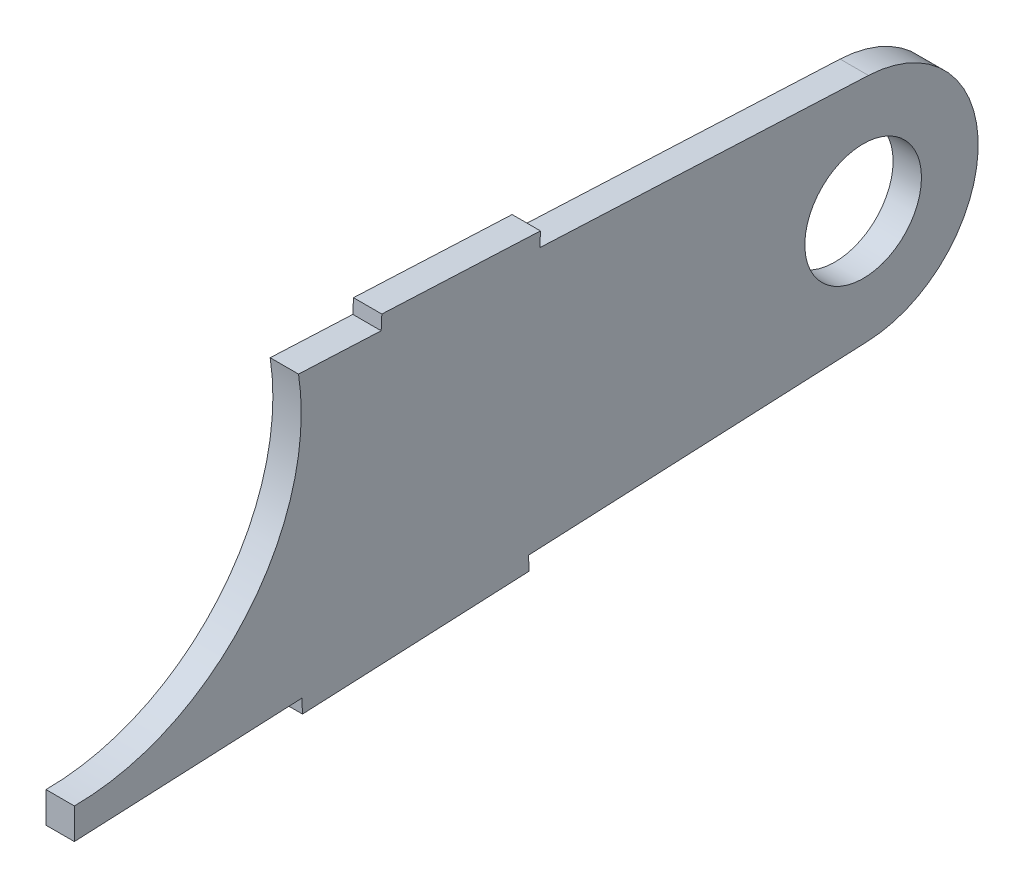
ISO-10303-21;
HEADER;
FILE_DESCRIPTION(('STEP AP214'),'2;1');
FILE_NAME('part.step','',(''),(''),'','','');
FILE_SCHEMA(('AUTOMOTIVE_DESIGN { 1 0 10303 214 1 1 1 1 }'));
ENDSEC;
DATA;
#1=APPLICATION_CONTEXT('core data for automotive mechanical design processes');
#2=APPLICATION_PROTOCOL_DEFINITION('international standard','automotive_design',2000,#1);
#3=PRODUCT_CONTEXT('',#1,'mechanical');
#4=PRODUCT('Part','Part','',(#3));
#5=PRODUCT_RELATED_PRODUCT_CATEGORY('part','',(#4));
#6=PRODUCT_DEFINITION_FORMATION('','',#4);
#7=PRODUCT_DEFINITION_CONTEXT('part definition',#1,'design');
#8=PRODUCT_DEFINITION('design','',#6,#7);
#9=PRODUCT_DEFINITION_SHAPE('','',#8);
#10=(LENGTH_UNIT() NAMED_UNIT(*) SI_UNIT(.MILLI.,.METRE.));
#11=(NAMED_UNIT(*) PLANE_ANGLE_UNIT() SI_UNIT($,.RADIAN.));
#12=(NAMED_UNIT(*) SI_UNIT($,.STERADIAN.) SOLID_ANGLE_UNIT());
#13=UNCERTAINTY_MEASURE_WITH_UNIT(LENGTH_MEASURE(1.E-05),#10,'distance_accuracy_value','');
#14=(GEOMETRIC_REPRESENTATION_CONTEXT(3) GLOBAL_UNCERTAINTY_ASSIGNED_CONTEXT((#13)) GLOBAL_UNIT_ASSIGNED_CONTEXT((#10,
#11,#12)) REPRESENTATION_CONTEXT('',''));
#15=CARTESIAN_POINT('',(0.,0.,0.));
#16=DIRECTION('',(0.,0.,1.));
#17=DIRECTION('',(1.,0.,0.));
#18=AXIS2_PLACEMENT_3D('',#15,#16,#17);
#19=CARTESIAN_POINT('',(0.79375,6.43204436244267,-0.297049708920377));
#20=DIRECTION('',(0.,-0.998935278144194,0.0461336111634559));
#21=DIRECTION('',(0.,-0.0461336111634559,-0.998935278144194));
#22=AXIS2_PLACEMENT_3D('',#19,#20,#21);
#23=PLANE('',#22);
#24=DIRECTION('',(0.,0.0461336111634559,0.998935278144194));
#25=VECTOR('',#24,1.);
#26=CARTESIAN_POINT('',(-0.79375,6.43204436244267,-0.297049708920377));
#27=LINE('',#26,#25);
#28=CARTESIAN_POINT('',(-0.79375,6.43204436244267,-0.297049708920377));
#29=VERTEX_POINT('',#28);
#30=CARTESIAN_POINT('',(-0.79375,7.28159481201771,18.098343438105));
#31=VERTEX_POINT('',#30);
#32=EDGE_CURVE('E234',#29,#31,#27,.T.);
#33=ORIENTED_EDGE('',*,*,#32,.T.);
#34=DIRECTION('',(-1.,0.,0.));
#35=VECTOR('',#34,1.);
#36=CARTESIAN_POINT('',(0.79375,7.28159481201771,18.098343438105));
#37=LINE('',#36,#35);
#38=CARTESIAN_POINT('',(0.79375,7.28159481201771,18.098343438105));
#39=VERTEX_POINT('',#38);
#40=EDGE_CURVE('E11',#39,#31,#37,.T.);
#41=ORIENTED_EDGE('',*,*,#40,.F.);
#42=DIRECTION('',(0.,0.0461336111634559,0.998935278144194));
#43=VECTOR('',#42,1.);
#44=CARTESIAN_POINT('',(0.79375,6.43204436244267,-0.297049708920377));
#45=LINE('',#44,#43);
#46=CARTESIAN_POINT('',(0.79375,6.43204436244267,-0.297049708920377));
#47=VERTEX_POINT('',#46);
#48=EDGE_CURVE('E188',#47,#39,#45,.T.);
#49=ORIENTED_EDGE('',*,*,#48,.F.);
#50=DIRECTION('',(-1.,0.,0.));
#51=VECTOR('',#50,1.);
#52=CARTESIAN_POINT('',(0.79375,6.43204436244267,-0.297049708920377));
#53=LINE('',#52,#51);
#54=EDGE_CURVE('E258',#47,#29,#53,.T.);
#55=ORIENTED_EDGE('',*,*,#54,.T.);
#56=EDGE_LOOP('',(#33,#41,#49,#55));
#57=FACE_BOUND('',#56,.T.);
#58=ADVANCED_FACE('F38',(#57),#23,.F.);
#59=CARTESIAN_POINT('',(0.79375,0.849550449575059,18.3953931470253));
#60=DIRECTION('',(0.,0.0461336111634569,0.998935278144194));
#61=DIRECTION('',(0.,-0.998935278144194,0.0461336111634569));
#62=AXIS2_PLACEMENT_3D('',#59,#60,#61);
#63=PLANE('',#62);
#64=DIRECTION('',(0.,0.998935278144194,-0.0461336111634569));
#65=VECTOR('',#64,1.);
#66=CARTESIAN_POINT('',(-0.79375,0.849550449575059,18.3953931470253));
#67=LINE('',#66,#65);
#68=CARTESIAN_POINT('',(-0.79375,8.07449968904462,18.061724884244));
#69=VERTEX_POINT('',#68);
#70=EDGE_CURVE('E230',#31,#69,#67,.T.);
#71=ORIENTED_EDGE('',*,*,#70,.T.);
#72=DIRECTION('',(-1.,0.,0.));
#73=VECTOR('',#72,1.);
#74=CARTESIAN_POINT('',(0.79375,8.07449968904462,18.061724884244));
#75=LINE('',#74,#73);
#76=CARTESIAN_POINT('',(0.79375,8.07449968904462,18.061724884244));
#77=VERTEX_POINT('',#76);
#78=EDGE_CURVE('E47',#77,#69,#75,.T.);
#79=ORIENTED_EDGE('',*,*,#78,.F.);
#80=DIRECTION('',(0.,0.998935278144194,-0.0461336111634569));
#81=VECTOR('',#80,1.);
#82=CARTESIAN_POINT('',(0.79375,0.849550449575059,18.3953931470253));
#83=LINE('',#82,#81);
#84=EDGE_CURVE('E109',#39,#77,#83,.T.);
#85=ORIENTED_EDGE('',*,*,#84,.F.);
#86=ORIENTED_EDGE('',*,*,#40,.T.);
#87=EDGE_LOOP('',(#71,#79,#85,#86));
#88=FACE_BOUND('',#87,.T.);
#89=ADVANCED_FACE('F40',(#88),#63,.F.);
#90=CARTESIAN_POINT('',(0.79375,7.22494923946958,-0.333668262781369));
#91=DIRECTION('',(0.,0.998935278144194,-0.0461336111634561));
#92=DIRECTION('',(0.,0.0461336111634561,0.998935278144194));
#93=AXIS2_PLACEMENT_3D('',#90,#91,#92);
#94=PLANE('',#93);
#95=DIRECTION('',(0.,-0.0461336111634561,-0.998935278144194));
#96=VECTOR('',#95,1.);
#97=CARTESIAN_POINT('',(-0.79375,7.22494923946958,-0.333668262781369));
#98=LINE('',#97,#96);
#99=CARTESIAN_POINT('',(-0.79375,8.48462749228775,26.9422595069459));
#100=VERTEX_POINT('',#99);
#101=EDGE_CURVE('E228',#100,#69,#98,.T.);
#102=ORIENTED_EDGE('',*,*,#101,.F.);
#103=DIRECTION('',(-1.,0.,0.));
#104=VECTOR('',#103,1.);
#105=CARTESIAN_POINT('',(0.79375,8.48462749228775,26.9422595069459));
#106=LINE('',#105,#104);
#107=CARTESIAN_POINT('',(0.79375,8.48462749228775,26.9422595069459));
#108=VERTEX_POINT('',#107);
#109=EDGE_CURVE('E222',#108,#100,#106,.T.);
#110=ORIENTED_EDGE('',*,*,#109,.F.);
#111=DIRECTION('',(0.,-0.0461336111634561,-0.998935278144194));
#112=VECTOR('',#111,1.);
#113=CARTESIAN_POINT('',(0.79375,7.22494923946958,-0.333668262781369));
#114=LINE('',#113,#112);
#115=EDGE_CURVE('E184',#108,#77,#114,.T.);
#116=ORIENTED_EDGE('',*,*,#115,.T.);
#117=ORIENTED_EDGE('',*,*,#78,.T.);
#118=EDGE_LOOP('',(#102,#110,#116,#117));
#119=FACE_BOUND('',#118,.T.);
#120=ADVANCED_FACE('F226',(#119),#94,.T.);
#121=CARTESIAN_POINT('',(0.79375,1.25967825281813,27.2759277697272));
#122=DIRECTION('',(0.,0.0461336111634547,0.998935278144194));
#123=DIRECTION('',(0.,-0.998935278144194,0.0461336111634547));
#124=AXIS2_PLACEMENT_3D('',#121,#122,#123);
#125=PLANE('',#124);
#126=DIRECTION('',(0.,0.998935278144194,-0.0461336111634547));
#127=VECTOR('',#126,1.);
#128=CARTESIAN_POINT('',(-0.79375,1.25967825281813,27.2759277697272));
#129=LINE('',#128,#127);
#130=CARTESIAN_POINT('',(-0.79375,7.69172261526084,26.9788780608068));
#131=VERTEX_POINT('',#130);
#132=EDGE_CURVE('E239',#131,#100,#129,.T.);
#133=ORIENTED_EDGE('',*,*,#132,.F.);
#134=DIRECTION('',(-1.,0.,0.));
#135=VECTOR('',#134,1.);
#136=CARTESIAN_POINT('',(0.79375,7.69172261526084,26.9788780608068));
#137=LINE('',#136,#135);
#138=CARTESIAN_POINT('',(0.79375,7.69172261526084,26.9788780608068));
#139=VERTEX_POINT('',#138);
#140=EDGE_CURVE('E208',#139,#131,#137,.T.);
#141=ORIENTED_EDGE('',*,*,#140,.F.);
#142=DIRECTION('',(0.,0.998935278144194,-0.0461336111634547));
#143=VECTOR('',#142,1.);
#144=CARTESIAN_POINT('',(0.79375,1.25967825281813,27.2759277697272));
#145=LINE('',#144,#143);
#146=EDGE_CURVE('E181',#139,#108,#145,.T.);
#147=ORIENTED_EDGE('',*,*,#146,.T.);
#148=ORIENTED_EDGE('',*,*,#109,.T.);
#149=EDGE_LOOP('',(#133,#141,#147,#148));
#150=FACE_BOUND('',#149,.T.);
#151=ADVANCED_FACE('F294',(#150),#125,.T.);
#152=CARTESIAN_POINT('',(-0.79375,7.90537836397786,31.6051854187014));
#153=VERTEX_POINT('',#152);
#154=EDGE_CURVE('E204',#131,#153,#27,.T.);
#155=ORIENTED_EDGE('',*,*,#154,.T.);
#156=DIRECTION('',(-1.,0.,0.));
#157=VECTOR('',#156,1.);
#158=CARTESIAN_POINT('',(0.79375,7.90537836397786,31.6051854187014));
#159=LINE('',#158,#157);
#160=CARTESIAN_POINT('',(0.79375,7.90537836397786,31.6051854187014));
#161=VERTEX_POINT('',#160);
#162=EDGE_CURVE('E201',#161,#153,#159,.T.);
#163=ORIENTED_EDGE('',*,*,#162,.F.);
#164=EDGE_CURVE('E178',#139,#161,#45,.T.);
#165=ORIENTED_EDGE('',*,*,#164,.F.);
#166=ORIENTED_EDGE('',*,*,#140,.T.);
#167=EDGE_LOOP('',(#155,#163,#165,#166));
#168=FACE_BOUND('',#167,.T.);
#169=ADVANCED_FACE('F202',(#168),#23,.F.);
#170=CARTESIAN_POINT('',(0.79375,5.94486906598629,44.1529502910796));
#171=DIRECTION('',(-1.,0.,0.));
#172=DIRECTION('',(0.,0.,1.));
#173=AXIS2_PLACEMENT_3D('',#170,#171,#172);
#174=CYLINDRICAL_SURFACE('',#173,12.7);
#175=CARTESIAN_POINT('',(-0.79375,5.94486906598629,44.1529502910796));
#176=DIRECTION('',(1.,0.,0.));
#177=DIRECTION('',(0.,0.,-1.));
#178=AXIS2_PLACEMENT_3D('',#175,#176,#177);
#179=CIRCLE('',#178,12.7);
#180=CARTESIAN_POINT('',(-0.79375,-6.75513093401371,44.1529502910796));
#181=VERTEX_POINT('',#180);
#182=EDGE_CURVE('E212',#181,#153,#179,.T.);
#183=ORIENTED_EDGE('',*,*,#182,.F.);
#184=DIRECTION('',(-1.,0.,0.));
#185=VECTOR('',#184,1.);
#186=CARTESIAN_POINT('',(0.79375,-6.75513093401371,44.1529502910796));
#187=LINE('',#186,#185);
#188=CARTESIAN_POINT('',(0.79375,-6.75513093401371,44.1529502910796));
#189=VERTEX_POINT('',#188);
#190=EDGE_CURVE('E209',#189,#181,#187,.T.);
#191=ORIENTED_EDGE('',*,*,#190,.F.);
#192=CARTESIAN_POINT('',(0.79375,5.94486906598629,44.1529502910796));
#193=DIRECTION('',(1.,0.,0.));
#194=DIRECTION('',(0.,0.,-1.));
#195=AXIS2_PLACEMENT_3D('',#192,#193,#194);
#196=CIRCLE('',#195,12.7);
#197=EDGE_CURVE('E174',#189,#161,#196,.T.);
#198=ORIENTED_EDGE('',*,*,#197,.T.);
#199=ORIENTED_EDGE('',*,*,#162,.T.);
#200=EDGE_LOOP('',(#183,#191,#198,#199));
#201=FACE_BOUND('',#200,.T.);
#202=ADVANCED_FACE('F211',(#201),#174,.F.);
#203=CARTESIAN_POINT('',(0.79375,0.,44.1529502910796));
#204=DIRECTION('',(0.,0.,1.));
#205=DIRECTION('',(0.,-1.,0.));
#206=AXIS2_PLACEMENT_3D('',#203,#204,#205);
#207=PLANE('',#206);
#208=DIRECTION('',(0.,1.,0.));
#209=VECTOR('',#208,1.);
#210=CARTESIAN_POINT('',(-0.79375,0.,44.1529502910796));
#211=LINE('',#210,#209);
#212=CARTESIAN_POINT('',(-0.79375,-8.4848690659863,44.1529502910796));
#213=VERTEX_POINT('',#212);
#214=EDGE_CURVE('E245',#213,#181,#211,.T.);
#215=ORIENTED_EDGE('',*,*,#214,.F.);
#216=DIRECTION('',(-1.,0.,0.));
#217=VECTOR('',#216,1.);
#218=CARTESIAN_POINT('',(0.79375,-8.4848690659863,44.1529502910796));
#219=LINE('',#218,#217);
#220=CARTESIAN_POINT('',(0.79375,-8.4848690659863,44.1529502910796));
#221=VERTEX_POINT('',#220);
#222=EDGE_CURVE('E215',#221,#213,#219,.T.);
#223=ORIENTED_EDGE('',*,*,#222,.F.);
#224=DIRECTION('',(0.,1.,0.));
#225=VECTOR('',#224,1.);
#226=CARTESIAN_POINT('',(0.79375,0.,44.1529502910796));
#227=LINE('',#226,#225);
#228=EDGE_CURVE('E169',#221,#189,#227,.T.);
#229=ORIENTED_EDGE('',*,*,#228,.T.);
#230=ORIENTED_EDGE('',*,*,#190,.T.);
#231=EDGE_LOOP('',(#215,#223,#229,#230));
#232=FACE_BOUND('',#231,.T.);
#233=ADVANCED_FACE('F299',(#232),#207,.T.);
#234=CARTESIAN_POINT('',(0.79375,-6.43204436244265,-0.29704970892038));
#235=DIRECTION('',(0.,-0.998935278144194,-0.0461336111634565));
#236=DIRECTION('',(0.,0.0461336111634565,-0.998935278144194));
#237=AXIS2_PLACEMENT_3D('',#234,#235,#236);
#238=PLANE('',#237);
#239=DIRECTION('',(0.,-0.0461336111634565,0.998935278144194));
#240=VECTOR('',#239,1.);
#241=CARTESIAN_POINT('',(-0.79375,-6.43204436244265,-0.29704970892038));
#242=LINE('',#241,#240);
#243=CARTESIAN_POINT('',(-0.79375,-7.89678651688241,31.4191453721581));
#244=VERTEX_POINT('',#243);
#245=EDGE_CURVE('E247',#244,#213,#242,.T.);
#246=ORIENTED_EDGE('',*,*,#245,.F.);
#247=DIRECTION('',(-1.,0.,0.));
#248=VECTOR('',#247,1.);
#249=CARTESIAN_POINT('',(0.79375,-7.89678651688241,31.4191453721581));
#250=LINE('',#249,#248);
#251=CARTESIAN_POINT('',(0.79375,-7.89678651688241,31.4191453721581));
#252=VERTEX_POINT('',#251);
#253=EDGE_CURVE('E217',#252,#244,#250,.T.);
#254=ORIENTED_EDGE('',*,*,#253,.F.);
#255=DIRECTION('',(0.,-0.0461336111634565,0.998935278144194));
#256=VECTOR('',#255,1.);
#257=CARTESIAN_POINT('',(0.79375,-6.43204436244265,-0.29704970892038));
#258=LINE('',#257,#256);
#259=EDGE_CURVE('E162',#252,#221,#258,.T.);
#260=ORIENTED_EDGE('',*,*,#259,.T.);
#261=ORIENTED_EDGE('',*,*,#222,.T.);
#262=EDGE_LOOP('',(#246,#254,#260,#261));
#263=FACE_BOUND('',#262,.T.);
#264=ADVANCED_FACE('F267',(#263),#238,.T.);
#265=CARTESIAN_POINT('',(0.79375,-1.46474215443981,31.7161950810785));
#266=DIRECTION('',(0.,-0.046133611163458,0.998935278144194));
#267=DIRECTION('',(0.,-0.998935278144194,-0.046133611163458));
#268=AXIS2_PLACEMENT_3D('',#265,#266,#267);
#269=PLANE('',#268);
#270=DIRECTION('',(0.,0.998935278144194,0.046133611163458));
#271=VECTOR('',#270,1.);
#272=CARTESIAN_POINT('',(-0.79375,-1.46474215443981,31.7161950810785));
#273=LINE('',#272,#271);
#274=CARTESIAN_POINT('',(-0.79375,-8.68969139390933,31.3825268182971));
#275=VERTEX_POINT('',#274);
#276=EDGE_CURVE('E250',#275,#244,#273,.T.);
#277=ORIENTED_EDGE('',*,*,#276,.F.);
#278=DIRECTION('',(-1.,0.,0.));
#279=VECTOR('',#278,1.);
#280=CARTESIAN_POINT('',(0.79375,-8.68969139390933,31.3825268182971));
#281=LINE('',#280,#279);
#282=CARTESIAN_POINT('',(0.79375,-8.68969139390933,31.3825268182971));
#283=VERTEX_POINT('',#282);
#284=EDGE_CURVE('E262',#283,#275,#281,.T.);
#285=ORIENTED_EDGE('',*,*,#284,.F.);
#286=DIRECTION('',(0.,0.998935278144194,0.046133611163458));
#287=VECTOR('',#286,1.);
#288=CARTESIAN_POINT('',(0.79375,-1.46474215443981,31.7161950810785));
#289=LINE('',#288,#287);
#290=EDGE_CURVE('E168',#283,#252,#289,.T.);
#291=ORIENTED_EDGE('',*,*,#290,.T.);
#292=ORIENTED_EDGE('',*,*,#253,.T.);
#293=EDGE_LOOP('',(#277,#285,#291,#292));
#294=FACE_BOUND('',#293,.T.);
#295=ADVANCED_FACE('F266',(#294),#269,.T.);
#296=CARTESIAN_POINT('',(0.79375,-7.22494923946966,-0.333668262781357));
#297=DIRECTION('',(0.,0.998935278144194,0.0461336111634539));
#298=DIRECTION('',(0.,-0.0461336111634539,0.998935278144195));
#299=AXIS2_PLACEMENT_3D('',#296,#297,#298);
#300=PLANE('',#299);
#301=DIRECTION('',(0.,0.0461336111634539,-0.998935278144195));
#302=VECTOR('',#301,1.);
#303=CARTESIAN_POINT('',(-0.79375,-7.22494923946966,-0.333668262781357));
#304=LINE('',#303,#302);
#305=CARTESIAN_POINT('',(-0.79375,-8.10379453213345,18.6960487858655));
#306=VERTEX_POINT('',#305);
#307=EDGE_CURVE('E254',#275,#306,#304,.T.);
#308=ORIENTED_EDGE('',*,*,#307,.T.);
#309=DIRECTION('',(-1.,0.,0.));
#310=VECTOR('',#309,1.);
#311=CARTESIAN_POINT('',(0.79375,-8.10379453213345,18.6960487858655));
#312=LINE('',#311,#310);
#313=CARTESIAN_POINT('',(0.79375,-8.10379453213345,18.6960487858655));
#314=VERTEX_POINT('',#313);
#315=EDGE_CURVE('E158',#314,#306,#312,.T.);
#316=ORIENTED_EDGE('',*,*,#315,.F.);
#317=DIRECTION('',(0.,0.0461336111634539,-0.998935278144195));
#318=VECTOR('',#317,1.);
#319=CARTESIAN_POINT('',(0.79375,-7.22494923946966,-0.333668262781357));
#320=LINE('',#319,#318);
#321=EDGE_CURVE('E145',#283,#314,#320,.T.);
#322=ORIENTED_EDGE('',*,*,#321,.F.);
#323=ORIENTED_EDGE('',*,*,#284,.T.);
#324=EDGE_LOOP('',(#308,#316,#322,#323));
#325=FACE_BOUND('',#324,.T.);
#326=ADVANCED_FACE('F270',(#325),#300,.F.);
#327=CARTESIAN_POINT('',(0.79375,-0.878845292663939,19.0297170486469));
#328=DIRECTION('',(0.,-0.0461336111634613,0.998935278144194));
#329=DIRECTION('',(0.,-0.998935278144194,-0.0461336111634613));
#330=AXIS2_PLACEMENT_3D('',#327,#328,#329);
#331=PLANE('',#330);
#332=DIRECTION('',(0.,0.998935278144194,0.0461336111634613));
#333=VECTOR('',#332,1.);
#334=CARTESIAN_POINT('',(-0.79375,-0.878845292663939,19.0297170486469));
#335=LINE('',#334,#333);
#336=CARTESIAN_POINT('',(-0.79375,-7.3108896551065,18.7326673397265));
#337=VERTEX_POINT('',#336);
#338=EDGE_CURVE('E154',#306,#337,#335,.T.);
#339=ORIENTED_EDGE('',*,*,#338,.T.);
#340=DIRECTION('',(-1.,0.,0.));
#341=VECTOR('',#340,1.);
#342=CARTESIAN_POINT('',(0.79375,-7.3108896551065,18.7326673397265));
#343=LINE('',#342,#341);
#344=CARTESIAN_POINT('',(0.79375,-7.3108896551065,18.7326673397265));
#345=VERTEX_POINT('',#344);
#346=EDGE_CURVE('E151',#345,#337,#343,.T.);
#347=ORIENTED_EDGE('',*,*,#346,.F.);
#348=DIRECTION('',(0.,0.998935278144194,0.0461336111634613));
#349=VECTOR('',#348,1.);
#350=CARTESIAN_POINT('',(0.79375,-0.878845292663939,19.0297170486469));
#351=LINE('',#350,#349);
#352=EDGE_CURVE('E137',#314,#345,#351,.T.);
#353=ORIENTED_EDGE('',*,*,#352,.F.);
#354=ORIENTED_EDGE('',*,*,#315,.T.);
#355=EDGE_LOOP('',(#339,#347,#353,#354));
#356=FACE_BOUND('',#355,.T.);
#357=ADVANCED_FACE('F152',(#356),#331,.F.);
#358=CARTESIAN_POINT('',(-0.79375,-6.43204436244265,-0.297049708920381));
#359=VERTEX_POINT('',#358);
#360=EDGE_CURVE('E251',#359,#337,#242,.T.);
#361=ORIENTED_EDGE('',*,*,#360,.F.);
#362=DIRECTION('',(-1.,0.,0.));
#363=VECTOR('',#362,1.);
#364=CARTESIAN_POINT('',(0.79375,-6.43204436244265,-0.297049708920381));
#365=LINE('',#364,#363);
#366=CARTESIAN_POINT('',(0.79375,-6.43204436244265,-0.297049708920381));
#367=VERTEX_POINT('',#366);
#368=EDGE_CURVE('E98',#367,#359,#365,.T.);
#369=ORIENTED_EDGE('',*,*,#368,.F.);
#370=EDGE_CURVE('E142',#367,#345,#258,.T.);
#371=ORIENTED_EDGE('',*,*,#370,.T.);
#372=ORIENTED_EDGE('',*,*,#346,.T.);
#373=EDGE_LOOP('',(#361,#369,#371,#372));
#374=FACE_BOUND('',#373,.T.);
#375=ADVANCED_FACE('F160',(#374),#238,.T.);
#376=CARTESIAN_POINT('',(0.79375,0.,0.));
#377=DIRECTION('',(-1.,0.,0.));
#378=DIRECTION('',(0.,0.,1.));
#379=AXIS2_PLACEMENT_3D('',#376,#377,#378);
#380=CYLINDRICAL_SURFACE('',#379,6.43890000000001);
#381=CARTESIAN_POINT('',(-0.79375,0.,0.));
#382=DIRECTION('',(1.,0.,0.));
#383=DIRECTION('',(0.,0.,-1.));
#384=AXIS2_PLACEMENT_3D('',#381,#382,#383);
#385=CIRCLE('',#384,6.43890000000001);
#386=EDGE_CURVE('E101',#359,#29,#385,.T.);
#387=ORIENTED_EDGE('',*,*,#386,.T.);
#388=ORIENTED_EDGE('',*,*,#54,.F.);
#389=CARTESIAN_POINT('',(0.79375,0.,0.));
#390=DIRECTION('',(1.,0.,0.));
#391=DIRECTION('',(0.,0.,-1.));
#392=AXIS2_PLACEMENT_3D('',#389,#390,#391);
#393=CIRCLE('',#392,6.43890000000001);
#394=EDGE_CURVE('E55',#367,#47,#393,.T.);
#395=ORIENTED_EDGE('',*,*,#394,.F.);
#396=ORIENTED_EDGE('',*,*,#368,.T.);
#397=EDGE_LOOP('',(#387,#388,#395,#396));
#398=FACE_BOUND('',#397,.T.);
#399=ADVANCED_FACE('F275',(#398),#380,.T.);
#400=CARTESIAN_POINT('',(0.79375,0.,0.));
#401=DIRECTION('',(-1.,0.,0.));
#402=DIRECTION('',(0.,0.,1.));
#403=AXIS2_PLACEMENT_3D('',#400,#401,#402);
#404=CYLINDRICAL_SURFACE('',#403,3.2639);
#405=CARTESIAN_POINT('',(0.79375,0.,0.));
#406=DIRECTION('',(1.,0.,0.));
#407=DIRECTION('',(0.,0.,-1.));
#408=AXIS2_PLACEMENT_3D('',#405,#406,#407);
#409=CIRCLE('',#408,3.2639);
#410=CARTESIAN_POINT('',(0.79375,0.,-3.2639));
#411=VERTEX_POINT('',#410);
#412=EDGE_CURVE('E163',#411,#411,#409,.T.);
#413=ORIENTED_EDGE('',*,*,#412,.T.);
#414=EDGE_LOOP('',(#413));
#415=FACE_BOUND('',#414,.T.);
#416=CARTESIAN_POINT('',(-0.79375,0.,0.));
#417=DIRECTION('',(1.,0.,0.));
#418=DIRECTION('',(0.,0.,-1.));
#419=AXIS2_PLACEMENT_3D('',#416,#417,#418);
#420=CIRCLE('',#419,3.2639);
#421=CARTESIAN_POINT('',(-0.79375,0.,-3.2639));
#422=VERTEX_POINT('',#421);
#423=EDGE_CURVE('E189',#422,#422,#420,.T.);
#424=ORIENTED_EDGE('',*,*,#423,.F.);
#425=EDGE_LOOP('',(#424));
#426=FACE_BOUND('',#425,.T.);
#427=ADVANCED_FACE('F277',(#415,#426),#404,.F.);
#428=CARTESIAN_POINT('',(0.79375,0.,0.));
#429=DIRECTION('',(1.,0.,0.));
#430=DIRECTION('',(0.,0.,-1.));
#431=AXIS2_PLACEMENT_3D('',#428,#429,#430);
#432=PLANE('',#431);
#433=ORIENTED_EDGE('',*,*,#48,.T.);
#434=ORIENTED_EDGE('',*,*,#84,.T.);
#435=ORIENTED_EDGE('',*,*,#115,.F.);
#436=ORIENTED_EDGE('',*,*,#146,.F.);
#437=ORIENTED_EDGE('',*,*,#164,.T.);
#438=ORIENTED_EDGE('',*,*,#197,.F.);
#439=ORIENTED_EDGE('',*,*,#228,.F.);
#440=ORIENTED_EDGE('',*,*,#259,.F.);
#441=ORIENTED_EDGE('',*,*,#290,.F.);
#442=ORIENTED_EDGE('',*,*,#321,.T.);
#443=ORIENTED_EDGE('',*,*,#352,.T.);
#444=ORIENTED_EDGE('',*,*,#370,.F.);
#445=ORIENTED_EDGE('',*,*,#394,.T.);
#446=EDGE_LOOP('',(#433,#434,#435,#436,#437,#438,#439,#440,#441,#442,#443,#444,#445));
#447=FACE_BOUND('',#446,.T.);
#448=ORIENTED_EDGE('',*,*,#412,.F.);
#449=EDGE_LOOP('',(#448));
#450=FACE_BOUND('',#449,.T.);
#451=ADVANCED_FACE('F139',(#447,#450),#432,.T.);
#452=CARTESIAN_POINT('',(-0.79375,0.,0.));
#453=DIRECTION('',(1.,0.,0.));
#454=DIRECTION('',(0.,0.,-1.));
#455=AXIS2_PLACEMENT_3D('',#452,#453,#454);
#456=PLANE('',#455);
#457=ORIENTED_EDGE('',*,*,#32,.F.);
#458=ORIENTED_EDGE('',*,*,#386,.F.);
#459=ORIENTED_EDGE('',*,*,#360,.T.);
#460=ORIENTED_EDGE('',*,*,#338,.F.);
#461=ORIENTED_EDGE('',*,*,#307,.F.);
#462=ORIENTED_EDGE('',*,*,#276,.T.);
#463=ORIENTED_EDGE('',*,*,#245,.T.);
#464=ORIENTED_EDGE('',*,*,#214,.T.);
#465=ORIENTED_EDGE('',*,*,#182,.T.);
#466=ORIENTED_EDGE('',*,*,#154,.F.);
#467=ORIENTED_EDGE('',*,*,#132,.T.);
#468=ORIENTED_EDGE('',*,*,#101,.T.);
#469=ORIENTED_EDGE('',*,*,#70,.F.);
#470=EDGE_LOOP('',(#457,#458,#459,#460,#461,#462,#463,#464,#465,#466,#467,#468,#469));
#471=FACE_BOUND('',#470,.T.);
#472=ORIENTED_EDGE('',*,*,#423,.T.);
#473=EDGE_LOOP('',(#472));
#474=FACE_BOUND('',#473,.T.);
#475=ADVANCED_FACE('F236',(#471,#474),#456,.F.);
#476=CLOSED_SHELL('',(#58,#89,#120,#151,#169,#202,#233,#264,#295,#326,#357,#375,#399,#427,#451,#475));
#477=MANIFOLD_SOLID_BREP('B2',#476);
#478=ADVANCED_BREP_SHAPE_REPRESENTATION('',(#18,#477),#14);
#479=SHAPE_DEFINITION_REPRESENTATION(#9,#478);
ENDSEC;
END-ISO-10303-21;
